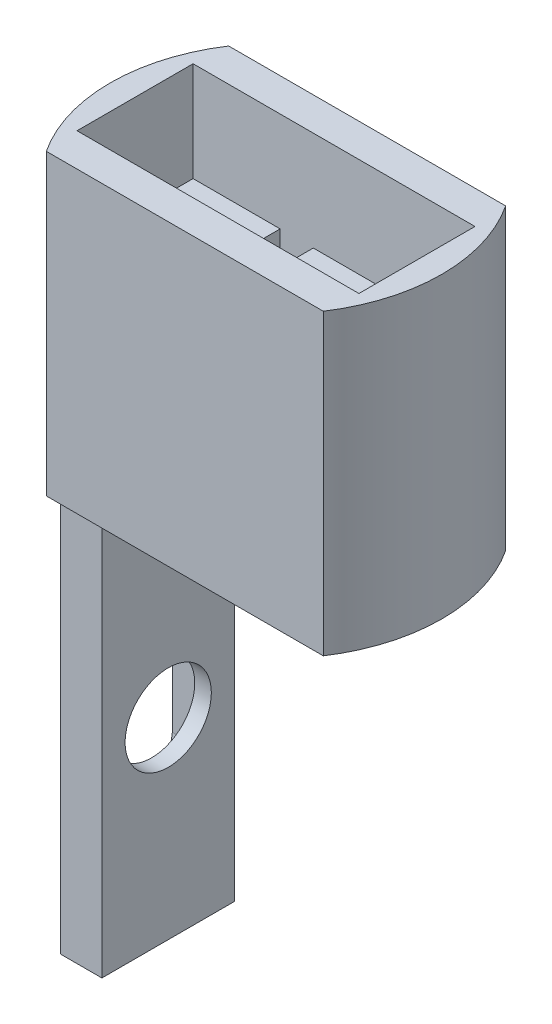
ISO-10303-21;
HEADER;
FILE_DESCRIPTION(('STEP AP214'),'2;1');
FILE_NAME('part.step','',(''),(''),'','','');
FILE_SCHEMA(('AUTOMOTIVE_DESIGN { 1 0 10303 214 1 1 1 1 }'));
ENDSEC;
DATA;
#1=APPLICATION_CONTEXT('core data for automotive mechanical design processes');
#2=APPLICATION_PROTOCOL_DEFINITION('international standard','automotive_design',2000,#1);
#3=PRODUCT_CONTEXT('',#1,'mechanical');
#4=PRODUCT('Part','Part','',(#3));
#5=PRODUCT_RELATED_PRODUCT_CATEGORY('part','',(#4));
#6=PRODUCT_DEFINITION_FORMATION('','',#4);
#7=PRODUCT_DEFINITION_CONTEXT('part definition',#1,'design');
#8=PRODUCT_DEFINITION('design','',#6,#7);
#9=PRODUCT_DEFINITION_SHAPE('','',#8);
#10=(LENGTH_UNIT() NAMED_UNIT(*) SI_UNIT(.MILLI.,.METRE.));
#11=(NAMED_UNIT(*) PLANE_ANGLE_UNIT() SI_UNIT($,.RADIAN.));
#12=(NAMED_UNIT(*) SI_UNIT($,.STERADIAN.) SOLID_ANGLE_UNIT());
#13=UNCERTAINTY_MEASURE_WITH_UNIT(LENGTH_MEASURE(1.E-05),#10,'distance_accuracy_value','');
#14=(GEOMETRIC_REPRESENTATION_CONTEXT(3) GLOBAL_UNCERTAINTY_ASSIGNED_CONTEXT((#13)) GLOBAL_UNIT_ASSIGNED_CONTEXT((#10,
#11,#12)) REPRESENTATION_CONTEXT('',''));
#15=CARTESIAN_POINT('',(0.,0.,0.));
#16=DIRECTION('',(0.,0.,1.));
#17=DIRECTION('',(1.,0.,0.));
#18=AXIS2_PLACEMENT_3D('',#15,#16,#17);
#19=CARTESIAN_POINT('',(-7.5,-2.9,2.75));
#20=DIRECTION('',(0.,1.,0.));
#21=DIRECTION('',(0.,0.,1.));
#22=AXIS2_PLACEMENT_3D('',#19,#20,#21);
#23=PLANE('',#22);
#24=DIRECTION('',(0.,0.,-1.));
#25=VECTOR('',#24,1.);
#26=CARTESIAN_POINT('',(-9.,-2.9,2.75));
#27=LINE('',#26,#25);
#28=CARTESIAN_POINT('',(-9.,-2.9,1.49997066480721));
#29=VERTEX_POINT('',#28);
#30=CARTESIAN_POINT('',(-9.,-2.9,-1.49997066480721));
#31=VERTEX_POINT('',#30);
#32=EDGE_CURVE('E61',#29,#31,#27,.T.);
#33=ORIENTED_EDGE('',*,*,#32,.T.);
#34=DIRECTION('',(-1.,0.,0.));
#35=VECTOR('',#34,1.);
#36=CARTESIAN_POINT('',(-7.5,-2.9,-1.49997066480721));
#37=LINE('',#36,#35);
#38=CARTESIAN_POINT('',(-7.5,-2.9,-1.49997066480721));
#39=VERTEX_POINT('',#38);
#40=EDGE_CURVE('E272',#39,#31,#37,.T.);
#41=ORIENTED_EDGE('',*,*,#40,.F.);
#42=DIRECTION('',(0.,0.,-1.));
#43=VECTOR('',#42,1.);
#44=CARTESIAN_POINT('',(-7.5,-2.9,2.75));
#45=LINE('',#44,#43);
#46=CARTESIAN_POINT('',(-7.5,-2.9,1.49997066480721));
#47=VERTEX_POINT('',#46);
#48=EDGE_CURVE('E366',#47,#39,#45,.T.);
#49=ORIENTED_EDGE('',*,*,#48,.F.);
#50=DIRECTION('',(-1.,0.,0.));
#51=VECTOR('',#50,1.);
#52=CARTESIAN_POINT('',(-7.5,-2.9,1.49997066480721));
#53=LINE('',#52,#51);
#54=EDGE_CURVE('E293',#47,#29,#53,.T.);
#55=ORIENTED_EDGE('',*,*,#54,.T.);
#56=EDGE_LOOP('',(#33,#41,#49,#55));
#57=FACE_BOUND('',#56,.T.);
#58=ADVANCED_FACE('F38',(#57),#23,.F.);
#59=CARTESIAN_POINT('',(-9.,-2.9,2.75));
#60=VERTEX_POINT('',#59);
#61=CARTESIAN_POINT('',(-9.,-2.9,2.7499706648072));
#62=VERTEX_POINT('',#61);
#63=EDGE_CURVE('E263',#60,#62,#27,.T.);
#64=ORIENTED_EDGE('',*,*,#63,.T.);
#65=DIRECTION('',(-1.,0.,0.));
#66=VECTOR('',#65,1.);
#67=CARTESIAN_POINT('',(-7.5,-2.9,2.7499706648072));
#68=LINE('',#67,#66);
#69=CARTESIAN_POINT('',(-7.5,-2.9,2.7499706648072));
#70=VERTEX_POINT('',#69);
#71=EDGE_CURVE('E298',#70,#62,#68,.T.);
#72=ORIENTED_EDGE('',*,*,#71,.F.);
#73=CARTESIAN_POINT('',(-7.5,-2.9,2.75));
#74=VERTEX_POINT('',#73);
#75=EDGE_CURVE('E362',#74,#70,#45,.T.);
#76=ORIENTED_EDGE('',*,*,#75,.F.);
#77=DIRECTION('',(-1.,0.,0.));
#78=VECTOR('',#77,1.);
#79=CARTESIAN_POINT('',(-7.5,-2.9,2.75));
#80=LINE('',#79,#78);
#81=EDGE_CURVE('E373',#74,#60,#80,.T.);
#82=ORIENTED_EDGE('',*,*,#81,.T.);
#83=EDGE_LOOP('',(#64,#72,#76,#82));
#84=FACE_BOUND('',#83,.T.);
#85=ADVANCED_FACE('F547',(#84),#23,.F.);
#86=CARTESIAN_POINT('',(-7.5,-23.9,2.75));
#87=DIRECTION('',(0.,-1.,0.));
#88=DIRECTION('',(0.,0.,-1.));
#89=AXIS2_PLACEMENT_3D('',#86,#87,#88);
#90=PLANE('',#89);
#91=DIRECTION('',(0.,0.,1.));
#92=VECTOR('',#91,1.);
#93=CARTESIAN_POINT('',(-9.,-23.9,2.75));
#94=LINE('',#93,#92);
#95=CARTESIAN_POINT('',(-9.,-23.9,-1.49997066480721));
#96=VERTEX_POINT('',#95);
#97=CARTESIAN_POINT('',(-9.,-23.9,1.49997066480721));
#98=VERTEX_POINT('',#97);
#99=EDGE_CURVE('E379',#96,#98,#94,.T.);
#100=ORIENTED_EDGE('',*,*,#99,.T.);
#101=DIRECTION('',(-1.,0.,0.));
#102=VECTOR('',#101,1.);
#103=CARTESIAN_POINT('',(-7.5,-23.9,1.49997066480721));
#104=LINE('',#103,#102);
#105=CARTESIAN_POINT('',(-7.5,-23.9,1.49997066480721));
#106=VERTEX_POINT('',#105);
#107=EDGE_CURVE('E312',#106,#98,#104,.T.);
#108=ORIENTED_EDGE('',*,*,#107,.F.);
#109=DIRECTION('',(0.,0.,1.));
#110=VECTOR('',#109,1.);
#111=CARTESIAN_POINT('',(-7.5,-23.9,2.75));
#112=LINE('',#111,#110);
#113=CARTESIAN_POINT('',(-7.5,-23.9,-1.49997066480721));
#114=VERTEX_POINT('',#113);
#115=EDGE_CURVE('E374',#114,#106,#112,.T.);
#116=ORIENTED_EDGE('',*,*,#115,.F.);
#117=DIRECTION('',(-1.,0.,0.));
#118=VECTOR('',#117,1.);
#119=CARTESIAN_POINT('',(-7.5,-23.9,-1.49997066480721));
#120=LINE('',#119,#118);
#121=EDGE_CURVE('E332',#114,#96,#120,.T.);
#122=ORIENTED_EDGE('',*,*,#121,.T.);
#123=EDGE_LOOP('',(#100,#108,#116,#122));
#124=FACE_BOUND('',#123,.T.);
#125=ADVANCED_FACE('F552',(#124),#90,.F.);
#126=CARTESIAN_POINT('',(-9.,-23.9,-2.75));
#127=VERTEX_POINT('',#126);
#128=CARTESIAN_POINT('',(-9.,-23.9,-2.7499706648072));
#129=VERTEX_POINT('',#128);
#130=EDGE_CURVE('E361',#127,#129,#94,.T.);
#131=ORIENTED_EDGE('',*,*,#130,.T.);
#132=DIRECTION('',(-1.,0.,0.));
#133=VECTOR('',#132,1.);
#134=CARTESIAN_POINT('',(-7.5,-23.9,-2.7499706648072));
#135=LINE('',#134,#133);
#136=CARTESIAN_POINT('',(-7.5,-23.9,-2.7499706648072));
#137=VERTEX_POINT('',#136);
#138=EDGE_CURVE('E337',#137,#129,#135,.T.);
#139=ORIENTED_EDGE('',*,*,#138,.F.);
#140=CARTESIAN_POINT('',(-7.5,-23.9,-2.75));
#141=VERTEX_POINT('',#140);
#142=EDGE_CURVE('E370',#141,#137,#112,.T.);
#143=ORIENTED_EDGE('',*,*,#142,.F.);
#144=DIRECTION('',(-1.,0.,0.));
#145=VECTOR('',#144,1.);
#146=CARTESIAN_POINT('',(-7.5,-23.9,-2.75));
#147=LINE('',#146,#145);
#148=EDGE_CURVE('E384',#141,#127,#147,.T.);
#149=ORIENTED_EDGE('',*,*,#148,.T.);
#150=EDGE_LOOP('',(#131,#139,#143,#149));
#151=FACE_BOUND('',#150,.T.);
#152=ADVANCED_FACE('F571',(#151),#90,.F.);
#153=CARTESIAN_POINT('',(0.,18.,0.));
#154=DIRECTION('',(0.,-1.,0.));
#155=DIRECTION('',(0.,0.,-1.));
#156=AXIS2_PLACEMENT_3D('',#153,#154,#155);
#157=CYLINDRICAL_SURFACE('',#156,10.);
#158=CARTESIAN_POINT('',(0.,18.,0.));
#159=DIRECTION('',(0.,1.,0.));
#160=DIRECTION('',(0.,0.,1.));
#161=AXIS2_PLACEMENT_3D('',#158,#159,#160);
#162=CIRCLE('',#161,10.);
#163=CARTESIAN_POINT('',(-8.35164654424503,18.,-5.5));
#164=VERTEX_POINT('',#163);
#165=CARTESIAN_POINT('',(-8.35164654424503,18.,5.5));
#166=VERTEX_POINT('',#165);
#167=EDGE_CURVE('E490',#164,#166,#162,.T.);
#168=ORIENTED_EDGE('',*,*,#167,.F.);
#169=DIRECTION('',(0.,-1.,0.));
#170=VECTOR('',#169,1.);
#171=CARTESIAN_POINT('',(-8.35164654424503,43.,-5.5));
#172=LINE('',#171,#170);
#173=CARTESIAN_POINT('',(-8.35164654424503,0.,-5.5));
#174=VERTEX_POINT('',#173);
#175=EDGE_CURVE('E349',#164,#174,#172,.T.);
#176=ORIENTED_EDGE('',*,*,#175,.T.);
#177=CARTESIAN_POINT('',(0.,0.,0.));
#178=DIRECTION('',(0.,1.,0.));
#179=DIRECTION('',(0.,0.,1.));
#180=AXIS2_PLACEMENT_3D('',#177,#178,#179);
#181=CIRCLE('',#180,10.);
#182=CARTESIAN_POINT('',(-8.35164654424503,0.,5.5));
#183=VERTEX_POINT('',#182);
#184=EDGE_CURVE('E486',#174,#183,#181,.T.);
#185=ORIENTED_EDGE('',*,*,#184,.T.);
#186=DIRECTION('',(0.,-1.,0.));
#187=VECTOR('',#186,1.);
#188=CARTESIAN_POINT('',(-8.35164654424503,43.,5.5));
#189=LINE('',#188,#187);
#190=EDGE_CURVE('E354',#166,#183,#189,.T.);
#191=ORIENTED_EDGE('',*,*,#190,.F.);
#192=EDGE_LOOP('',(#168,#176,#185,#191));
#193=FACE_BOUND('',#192,.T.);
#194=ADVANCED_FACE('F506',(#193),#157,.T.);
#195=CARTESIAN_POINT('',(-10.001,-13.4,0.));
#196=DIRECTION('',(1.,0.,0.));
#197=DIRECTION('',(0.,0.,-1.));
#198=AXIS2_PLACEMENT_3D('',#195,#196,#197);
#199=CYLINDRICAL_SURFACE('',#198,2.6);
#200=CARTESIAN_POINT('',(-6.5,-13.4,0.));
#201=DIRECTION('',(1.,0.,0.));
#202=DIRECTION('',(0.,0.,-1.));
#203=AXIS2_PLACEMENT_3D('',#200,#201,#202);
#204=CIRCLE('',#203,2.6);
#205=CARTESIAN_POINT('',(-6.5,-13.4,-2.6));
#206=VERTEX_POINT('',#205);
#207=EDGE_CURVE('E444',#206,#206,#204,.T.);
#208=CARTESIAN_POINT('',(-7.5,-13.4,0.));
#209=DIRECTION('',(-1.,0.,0.));
#210=DIRECTION('',(0.,0.,1.));
#211=AXIS2_PLACEMENT_3D('',#208,#209,#210);
#212=CIRCLE('',#211,2.6);
#213=CARTESIAN_POINT('',(-7.5,-13.4,-2.6));
#214=VERTEX_POINT('',#213);
#215=EDGE_CURVE('E383',#214,#214,#212,.F.);
#216=CARTESIAN_POINT('',(-6.5,-13.4,-2.6));
#217=CARTESIAN_POINT('',(-6.51041666666667,-13.4,-2.6));
#218=CARTESIAN_POINT('',(-6.52083333333333,-13.4,-2.6));
#219=CARTESIAN_POINT('',(-6.54166666666667,-13.4,-2.6));
#220=CARTESIAN_POINT('',(-6.55208333333333,-13.4,-2.6));
#221=CARTESIAN_POINT('',(-6.57291666666667,-13.4,-2.6));
#222=CARTESIAN_POINT('',(-6.58333333333333,-13.4,-2.6));
#223=CARTESIAN_POINT('',(-6.60416666666667,-13.4,-2.6));
#224=CARTESIAN_POINT('',(-6.61458333333333,-13.4,-2.6));
#225=CARTESIAN_POINT('',(-6.63541666666667,-13.4,-2.6));
#226=CARTESIAN_POINT('',(-6.64583333333333,-13.4,-2.6));
#227=CARTESIAN_POINT('',(-6.66666666666667,-13.4,-2.6));
#228=CARTESIAN_POINT('',(-6.67708333333333,-13.4,-2.6));
#229=CARTESIAN_POINT('',(-6.69791666666667,-13.4,-2.6));
#230=CARTESIAN_POINT('',(-6.70833333333333,-13.4,-2.6));
#231=CARTESIAN_POINT('',(-6.72916666666667,-13.4,-2.6));
#232=CARTESIAN_POINT('',(-6.73958333333333,-13.4,-2.6));
#233=CARTESIAN_POINT('',(-6.76041666666667,-13.4,-2.6));
#234=CARTESIAN_POINT('',(-6.77083333333333,-13.4,-2.6));
#235=CARTESIAN_POINT('',(-6.79166666666667,-13.4,-2.6));
#236=CARTESIAN_POINT('',(-6.80208333333333,-13.4,-2.6));
#237=CARTESIAN_POINT('',(-6.82291666666667,-13.4,-2.6));
#238=CARTESIAN_POINT('',(-6.83333333333333,-13.4,-2.6));
#239=CARTESIAN_POINT('',(-6.85416666666667,-13.4,-2.6));
#240=CARTESIAN_POINT('',(-6.86458333333333,-13.4,-2.6));
#241=CARTESIAN_POINT('',(-6.88541666666667,-13.4,-2.6));
#242=CARTESIAN_POINT('',(-6.89583333333333,-13.4,-2.6));
#243=CARTESIAN_POINT('',(-6.91666666666667,-13.4,-2.6));
#244=CARTESIAN_POINT('',(-6.92708333333333,-13.4,-2.6));
#245=CARTESIAN_POINT('',(-6.94791666666667,-13.4,-2.6));
#246=CARTESIAN_POINT('',(-6.95833333333333,-13.4,-2.6));
#247=CARTESIAN_POINT('',(-6.97916666666667,-13.4,-2.6));
#248=CARTESIAN_POINT('',(-6.98958333333333,-13.4,-2.6));
#249=CARTESIAN_POINT('',(-7.01041666666667,-13.4,-2.6));
#250=CARTESIAN_POINT('',(-7.02083333333333,-13.4,-2.6));
#251=CARTESIAN_POINT('',(-7.04166666666667,-13.4,-2.6));
#252=CARTESIAN_POINT('',(-7.05208333333333,-13.4,-2.6));
#253=CARTESIAN_POINT('',(-7.07291666666667,-13.4,-2.6));
#254=CARTESIAN_POINT('',(-7.08333333333333,-13.4,-2.6));
#255=CARTESIAN_POINT('',(-7.10416666666667,-13.4,-2.6));
#256=CARTESIAN_POINT('',(-7.11458333333333,-13.4,-2.6));
#257=CARTESIAN_POINT('',(-7.13541666666667,-13.4,-2.6));
#258=CARTESIAN_POINT('',(-7.14583333333333,-13.4,-2.6));
#259=CARTESIAN_POINT('',(-7.16666666666667,-13.4,-2.6));
#260=CARTESIAN_POINT('',(-7.17708333333333,-13.4,-2.6));
#261=CARTESIAN_POINT('',(-7.19791666666667,-13.4,-2.6));
#262=CARTESIAN_POINT('',(-7.20833333333333,-13.4,-2.6));
#263=CARTESIAN_POINT('',(-7.22916666666667,-13.4,-2.6));
#264=CARTESIAN_POINT('',(-7.23958333333333,-13.4,-2.6));
#265=CARTESIAN_POINT('',(-7.26041666666667,-13.4,-2.6));
#266=CARTESIAN_POINT('',(-7.27083333333333,-13.4,-2.6));
#267=CARTESIAN_POINT('',(-7.29166666666667,-13.4,-2.6));
#268=CARTESIAN_POINT('',(-7.30208333333333,-13.4,-2.6));
#269=CARTESIAN_POINT('',(-7.32291666666667,-13.4,-2.6));
#270=CARTESIAN_POINT('',(-7.33333333333333,-13.4,-2.6));
#271=CARTESIAN_POINT('',(-7.35416666666667,-13.4,-2.6));
#272=CARTESIAN_POINT('',(-7.36458333333333,-13.4,-2.6));
#273=CARTESIAN_POINT('',(-7.38541666666667,-13.4,-2.6));
#274=CARTESIAN_POINT('',(-7.39583333333333,-13.4,-2.6));
#275=CARTESIAN_POINT('',(-7.41666666666667,-13.4,-2.6));
#276=CARTESIAN_POINT('',(-7.42708333333333,-13.4,-2.6));
#277=CARTESIAN_POINT('',(-7.44791666666667,-13.4,-2.6));
#278=CARTESIAN_POINT('',(-7.45833333333333,-13.4,-2.6));
#279=CARTESIAN_POINT('',(-7.47916666666667,-13.4,-2.6));
#280=CARTESIAN_POINT('',(-7.48958333333333,-13.4,-2.6));
#281=CARTESIAN_POINT('',(-7.5,-13.4,-2.6));
#282=B_SPLINE_CURVE_WITH_KNOTS('',3,(#216,#217,#218,#219,#220,#221,#222,#223,#224,#225,#226,
#227,#228,#229,#230,#231,#232,#233,#234,#235,#236,#237,#238,#239,#240,#241,#242,#243,#244,#245,
#246,#247,#248,#249,#250,#251,#252,#253,#254,#255,#256,#257,#258,#259,#260,#261,#262,#263,#264,
#265,#266,#267,#268,#269,#270,#271,#272,#273,#274,#275,#276,#277,#278,#279,#280,#281),
.UNSPECIFIED.,.F.,.F.,(4,2,2,2,2,2,2,2,2,2,2,2,2,2,2,2,2,2,2,2,2,2,2,2,2,2,2,2,2,2,2,2,4),(0.,
0.03125,0.0625000000000001,0.0937500000000001,0.125,0.15625,0.1875,0.21875,0.25,0.28125,
0.312500000000001,0.343750000000001,0.375000000000001,0.406250000000001,0.437500000000001,
0.468750000000001,0.500000000000001,0.531250000000001,0.562500000000001,0.593750000000001,
0.625000000000001,0.656250000000001,0.687500000000002,0.718750000000002,0.750000000000002,
0.781250000000002,0.812500000000002,0.843750000000002,0.875000000000003,0.906250000000003,
0.937500000000003,0.968750000000003,1.),.UNSPECIFIED.);
#283=EDGE_CURVE('BSEAM677',#206,#214,#282,.T.);
#284=ORIENTED_EDGE('',*,*,#207,.T.);
#285=ORIENTED_EDGE('',*,*,#215,.F.);
#286=ORIENTED_EDGE('',*,*,#283,.T.);
#287=ORIENTED_EDGE('',*,*,#283,.F.);
#288=EDGE_LOOP('',(#284,#286,#285,#287));
#289=FACE_BOUND('',#288,.T.);
#290=ADVANCED_FACE('F677',(#289),#199,.F.);
#291=CARTESIAN_POINT('',(0.,12.,0.));
#292=DIRECTION('',(0.,-1.,0.));
#293=DIRECTION('',(0.,0.,-1.));
#294=AXIS2_PLACEMENT_3D('',#291,#292,#293);
#295=PLANE('',#294);
#296=DIRECTION('',(0.,0.,-1.));
#297=VECTOR('',#296,1.);
#298=CARTESIAN_POINT('',(-1.25,12.,-3.5));
#299=LINE('',#298,#297);
#300=CARTESIAN_POINT('',(-1.25,12.,3.5));
#301=VERTEX_POINT('',#300);
#302=CARTESIAN_POINT('',(-1.25,12.,-3.5));
#303=VERTEX_POINT('',#302);
#304=EDGE_CURVE('E404',#301,#303,#299,.T.);
#305=ORIENTED_EDGE('',*,*,#304,.F.);
#306=DIRECTION('',(1.,0.,0.));
#307=VECTOR('',#306,1.);
#308=CARTESIAN_POINT('',(-8.5,12.,3.5));
#309=LINE('',#308,#307);
#310=CARTESIAN_POINT('',(8.5,12.,3.5));
#311=VERTEX_POINT('',#310);
#312=EDGE_CURVE('E420',#301,#311,#309,.T.);
#313=ORIENTED_EDGE('',*,*,#312,.T.);
#314=DIRECTION('',(0.,0.,-1.));
#315=VECTOR('',#314,1.);
#316=CARTESIAN_POINT('',(8.5,12.,3.5));
#317=LINE('',#316,#315);
#318=CARTESIAN_POINT('',(8.5,12.,-3.5));
#319=VERTEX_POINT('',#318);
#320=EDGE_CURVE('E425',#311,#319,#317,.T.);
#321=ORIENTED_EDGE('',*,*,#320,.T.);
#322=DIRECTION('',(-1.,0.,0.));
#323=VECTOR('',#322,1.);
#324=CARTESIAN_POINT('',(-8.5,12.,-3.5));
#325=LINE('',#324,#323);
#326=EDGE_CURVE('E429',#319,#303,#325,.T.);
#327=ORIENTED_EDGE('',*,*,#326,.T.);
#328=EDGE_LOOP('',(#305,#313,#321,#327));
#329=FACE_BOUND('',#328,.T.);
#330=ADVANCED_FACE('F702',(#329),#295,.F.);
#331=DIRECTION('',(0.,0.,1.));
#332=VECTOR('',#331,1.);
#333=CARTESIAN_POINT('',(-3.25,12.,-3.5));
#334=LINE('',#333,#332);
#335=CARTESIAN_POINT('',(-3.25,12.,-3.5));
#336=VERTEX_POINT('',#335);
#337=CARTESIAN_POINT('',(-3.25,12.,3.5));
#338=VERTEX_POINT('',#337);
#339=EDGE_CURVE('E394',#336,#338,#334,.T.);
#340=ORIENTED_EDGE('',*,*,#339,.F.);
#341=CARTESIAN_POINT('',(-8.5,12.,-3.5));
#342=VERTEX_POINT('',#341);
#343=EDGE_CURVE('E428',#336,#342,#325,.T.);
#344=ORIENTED_EDGE('',*,*,#343,.T.);
#345=DIRECTION('',(0.,0.,1.));
#346=VECTOR('',#345,1.);
#347=CARTESIAN_POINT('',(-8.5,12.,3.5));
#348=LINE('',#347,#346);
#349=CARTESIAN_POINT('',(-8.5,12.,3.5));
#350=VERTEX_POINT('',#349);
#351=EDGE_CURVE('E417',#342,#350,#348,.T.);
#352=ORIENTED_EDGE('',*,*,#351,.T.);
#353=EDGE_CURVE('E422',#350,#338,#309,.T.);
#354=ORIENTED_EDGE('',*,*,#353,.T.);
#355=EDGE_LOOP('',(#340,#344,#352,#354));
#356=FACE_BOUND('',#355,.T.);
#357=ADVANCED_FACE('F521',(#356),#295,.F.);
#358=CARTESIAN_POINT('',(0.,0.,0.));
#359=DIRECTION('',(0.,1.,0.));
#360=DIRECTION('',(0.,0.,1.));
#361=AXIS2_PLACEMENT_3D('',#358,#359,#360);
#362=PLANE('',#361);
#363=ORIENTED_EDGE('',*,*,#184,.F.);
#364=DIRECTION('',(-1.,0.,0.));
#365=VECTOR('',#364,1.);
#366=CARTESIAN_POINT('',(8.35164654424503,0.,-5.5));
#367=LINE('',#366,#365);
#368=CARTESIAN_POINT('',(8.35164654424503,0.,-5.5));
#369=VERTEX_POINT('',#368);
#370=EDGE_CURVE('E345',#369,#174,#367,.T.);
#371=ORIENTED_EDGE('',*,*,#370,.F.);
#372=CARTESIAN_POINT('',(8.35164654424503,0.,5.5));
#373=VERTEX_POINT('',#372);
#374=EDGE_CURVE('E491',#373,#369,#181,.T.);
#375=ORIENTED_EDGE('',*,*,#374,.F.);
#376=DIRECTION('',(1.,0.,0.));
#377=VECTOR('',#376,1.);
#378=CARTESIAN_POINT('',(8.35164654424503,0.,5.5));
#379=LINE('',#378,#377);
#380=EDGE_CURVE('E340',#183,#373,#379,.T.);
#381=ORIENTED_EDGE('',*,*,#380,.F.);
#382=EDGE_LOOP('',(#363,#371,#375,#381));
#383=FACE_BOUND('',#382,.T.);
#384=DIRECTION('',(0.,0.,1.));
#385=VECTOR('',#384,1.);
#386=CARTESIAN_POINT('',(-6.5,0.,-4.));
#387=LINE('',#386,#385);
#388=CARTESIAN_POINT('',(-6.5,0.,-4.));
#389=VERTEX_POINT('',#388);
#390=CARTESIAN_POINT('',(-6.5,0.,4.));
#391=VERTEX_POINT('',#390);
#392=EDGE_CURVE('E453',#389,#391,#387,.T.);
#393=ORIENTED_EDGE('',*,*,#392,.F.);
#394=DIRECTION('',(1.,0.,0.));
#395=VECTOR('',#394,1.);
#396=CARTESIAN_POINT('',(-9.,0.,-4.));
#397=LINE('',#396,#395);
#398=CARTESIAN_POINT('',(-9.,0.,-4.));
#399=VERTEX_POINT('',#398);
#400=EDGE_CURVE('E458',#399,#389,#397,.T.);
#401=ORIENTED_EDGE('',*,*,#400,.F.);
#402=DIRECTION('',(0.,0.,-1.));
#403=VECTOR('',#402,1.);
#404=CARTESIAN_POINT('',(-9.,0.,-4.));
#405=LINE('',#404,#403);
#406=CARTESIAN_POINT('',(-9.,0.,4.));
#407=VERTEX_POINT('',#406);
#408=EDGE_CURVE('E470',#407,#399,#405,.T.);
#409=ORIENTED_EDGE('',*,*,#408,.F.);
#410=DIRECTION('',(-1.,0.,0.));
#411=VECTOR('',#410,1.);
#412=CARTESIAN_POINT('',(-9.,0.,4.));
#413=LINE('',#412,#411);
#414=EDGE_CURVE('E467',#391,#407,#413,.T.);
#415=ORIENTED_EDGE('',*,*,#414,.F.);
#416=EDGE_LOOP('',(#393,#401,#409,#415));
#417=FACE_BOUND('',#416,.T.);
#418=ADVANCED_FACE('F518',(#383,#417),#362,.F.);
#419=ORIENTED_EDGE('',*,*,#374,.T.);
#420=DIRECTION('',(0.,-1.,0.));
#421=VECTOR('',#420,1.);
#422=CARTESIAN_POINT('',(8.35164654424503,43.,-5.5));
#423=LINE('',#422,#421);
#424=CARTESIAN_POINT('',(8.35164654424503,18.,-5.5));
#425=VERTEX_POINT('',#424);
#426=EDGE_CURVE('E347',#425,#369,#423,.T.);
#427=ORIENTED_EDGE('',*,*,#426,.F.);
#428=CARTESIAN_POINT('',(8.35164654424503,18.,5.5));
#429=VERTEX_POINT('',#428);
#430=EDGE_CURVE('E487',#429,#425,#162,.T.);
#431=ORIENTED_EDGE('',*,*,#430,.F.);
#432=DIRECTION('',(0.,-1.,0.));
#433=VECTOR('',#432,1.);
#434=CARTESIAN_POINT('',(8.35164654424503,43.,5.5));
#435=LINE('',#434,#433);
#436=EDGE_CURVE('E348',#429,#373,#435,.T.);
#437=ORIENTED_EDGE('',*,*,#436,.T.);
#438=EDGE_LOOP('',(#419,#427,#431,#437));
#439=FACE_BOUND('',#438,.T.);
#440=ADVANCED_FACE('F40',(#439),#157,.T.);
#441=CARTESIAN_POINT('',(0.,18.,0.));
#442=DIRECTION('',(0.,1.,0.));
#443=DIRECTION('',(0.,0.,1.));
#444=AXIS2_PLACEMENT_3D('',#441,#442,#443);
#445=PLANE('',#444);
#446=DIRECTION('',(1.,0.,0.));
#447=VECTOR('',#446,1.);
#448=CARTESIAN_POINT('',(0.,18.,-5.5));
#449=LINE('',#448,#447);
#450=EDGE_CURVE('E12',#164,#425,#449,.T.);
#451=ORIENTED_EDGE('',*,*,#450,.F.);
#452=ORIENTED_EDGE('',*,*,#167,.T.);
#453=DIRECTION('',(-1.,0.,0.));
#454=VECTOR('',#453,1.);
#455=CARTESIAN_POINT('',(0.,18.,5.5));
#456=LINE('',#455,#454);
#457=EDGE_CURVE('E46',#429,#166,#456,.T.);
#458=ORIENTED_EDGE('',*,*,#457,.F.);
#459=ORIENTED_EDGE('',*,*,#430,.T.);
#460=EDGE_LOOP('',(#451,#452,#458,#459));
#461=FACE_BOUND('',#460,.T.);
#462=DIRECTION('',(0.,0.,1.));
#463=VECTOR('',#462,1.);
#464=CARTESIAN_POINT('',(-8.5,18.,3.5));
#465=LINE('',#464,#463);
#466=CARTESIAN_POINT('',(-8.5,18.,-3.5));
#467=VERTEX_POINT('',#466);
#468=CARTESIAN_POINT('',(-8.5,18.,3.5));
#469=VERTEX_POINT('',#468);
#470=EDGE_CURVE('E411',#467,#469,#465,.T.);
#471=ORIENTED_EDGE('',*,*,#470,.F.);
#472=DIRECTION('',(-1.,0.,0.));
#473=VECTOR('',#472,1.);
#474=CARTESIAN_POINT('',(-8.5,18.,-3.5));
#475=LINE('',#474,#473);
#476=CARTESIAN_POINT('',(8.5,18.,-3.5));
#477=VERTEX_POINT('',#476);
#478=EDGE_CURVE('E421',#477,#467,#475,.T.);
#479=ORIENTED_EDGE('',*,*,#478,.F.);
#480=DIRECTION('',(0.,0.,-1.));
#481=VECTOR('',#480,1.);
#482=CARTESIAN_POINT('',(8.5,18.,3.5));
#483=LINE('',#482,#481);
#484=CARTESIAN_POINT('',(8.5,18.,3.5));
#485=VERTEX_POINT('',#484);
#486=EDGE_CURVE('E437',#485,#477,#483,.T.);
#487=ORIENTED_EDGE('',*,*,#486,.F.);
#488=DIRECTION('',(1.,0.,0.));
#489=VECTOR('',#488,1.);
#490=CARTESIAN_POINT('',(-8.5,18.,3.5));
#491=LINE('',#490,#489);
#492=EDGE_CURVE('E434',#469,#485,#491,.T.);
#493=ORIENTED_EDGE('',*,*,#492,.F.);
#494=EDGE_LOOP('',(#471,#479,#487,#493));
#495=FACE_BOUND('',#494,.T.);
#496=ADVANCED_FACE('F509',(#461,#495),#445,.T.);
#497=CARTESIAN_POINT('',(-6.5,-25.,-4.));
#498=DIRECTION('',(-1.,0.,0.));
#499=DIRECTION('',(0.,0.,1.));
#500=AXIS2_PLACEMENT_3D('',#497,#498,#499);
#501=PLANE('',#500);
#502=ORIENTED_EDGE('',*,*,#207,.F.);
#503=EDGE_LOOP('',(#502));
#504=FACE_BOUND('',#503,.T.);
#505=ORIENTED_EDGE('',*,*,#392,.T.);
#506=DIRECTION('',(0.,1.,0.));
#507=VECTOR('',#506,1.);
#508=CARTESIAN_POINT('',(-6.5,-25.,4.));
#509=LINE('',#508,#507);
#510=CARTESIAN_POINT('',(-6.5,-25.,4.));
#511=VERTEX_POINT('',#510);
#512=EDGE_CURVE('E483',#511,#391,#509,.T.);
#513=ORIENTED_EDGE('',*,*,#512,.F.);
#514=DIRECTION('',(0.,0.,1.));
#515=VECTOR('',#514,1.);
#516=CARTESIAN_POINT('',(-6.5,-25.,-4.));
#517=LINE('',#516,#515);
#518=CARTESIAN_POINT('',(-6.5,-25.,-4.));
#519=VERTEX_POINT('',#518);
#520=EDGE_CURVE('E454',#519,#511,#517,.T.);
#521=ORIENTED_EDGE('',*,*,#520,.F.);
#522=DIRECTION('',(0.,1.,0.));
#523=VECTOR('',#522,1.);
#524=CARTESIAN_POINT('',(-6.5,-25.,-4.));
#525=LINE('',#524,#523);
#526=EDGE_CURVE('E464',#519,#389,#525,.T.);
#527=ORIENTED_EDGE('',*,*,#526,.T.);
#528=EDGE_LOOP('',(#505,#513,#521,#527));
#529=FACE_BOUND('',#528,.T.);
#530=ADVANCED_FACE('F530',(#504,#529),#501,.F.);
#531=CARTESIAN_POINT('',(-9.,-25.,4.));
#532=DIRECTION('',(0.,0.,-1.));
#533=DIRECTION('',(-1.,0.,0.));
#534=AXIS2_PLACEMENT_3D('',#531,#532,#533);
#535=PLANE('',#534);
#536=ORIENTED_EDGE('',*,*,#414,.T.);
#537=DIRECTION('',(0.,1.,0.));
#538=VECTOR('',#537,1.);
#539=CARTESIAN_POINT('',(-9.,-25.,4.));
#540=LINE('',#539,#538);
#541=CARTESIAN_POINT('',(-9.,-25.,4.));
#542=VERTEX_POINT('',#541);
#543=EDGE_CURVE('E480',#542,#407,#540,.T.);
#544=ORIENTED_EDGE('',*,*,#543,.F.);
#545=DIRECTION('',(-1.,0.,0.));
#546=VECTOR('',#545,1.);
#547=CARTESIAN_POINT('',(-9.,-25.,4.));
#548=LINE('',#547,#546);
#549=EDGE_CURVE('E457',#511,#542,#548,.T.);
#550=ORIENTED_EDGE('',*,*,#549,.F.);
#551=ORIENTED_EDGE('',*,*,#512,.T.);
#552=EDGE_LOOP('',(#536,#544,#550,#551));
#553=FACE_BOUND('',#552,.T.);
#554=ADVANCED_FACE('F536',(#553),#535,.F.);
#555=CARTESIAN_POINT('',(-9.,-25.,-4.));
#556=DIRECTION('',(1.,0.,0.));
#557=DIRECTION('',(0.,0.,-1.));
#558=AXIS2_PLACEMENT_3D('',#555,#556,#557);
#559=PLANE('',#558);
#560=ORIENTED_EDGE('',*,*,#63,.F.);
#561=DIRECTION('',(0.,1.,0.));
#562=VECTOR('',#561,1.);
#563=CARTESIAN_POINT('',(-9.,-23.9,2.75));
#564=LINE('',#563,#562);
#565=CARTESIAN_POINT('',(-9.,-23.9,2.75));
#566=VERTEX_POINT('',#565);
#567=EDGE_CURVE('E261',#566,#60,#564,.T.);
#568=ORIENTED_EDGE('',*,*,#567,.F.);
#569=CARTESIAN_POINT('',(-9.,-23.9,2.7499706648072));
#570=VERTEX_POINT('',#569);
#571=EDGE_CURVE('E377',#570,#566,#94,.T.);
#572=ORIENTED_EDGE('',*,*,#571,.F.);
#573=DIRECTION('',(0.,1.,0.));
#574=VECTOR('',#573,1.);
#575=CARTESIAN_POINT('',(-9.,-23.9,2.7499706648072));
#576=LINE('',#575,#574);
#577=CARTESIAN_POINT('',(-9.,-16.8,2.74997066480719));
#578=VERTEX_POINT('',#577);
#579=EDGE_CURVE('E309',#570,#578,#576,.T.);
#580=ORIENTED_EDGE('',*,*,#579,.T.);
#581=DIRECTION('',(0.,-0.984853300679229,-0.173389665612539));
#582=VECTOR('',#581,1.);
#583=CARTESIAN_POINT('',(-9.,-16.8,2.74997066480719));
#584=LINE('',#583,#582);
#585=EDGE_CURVE('E301',#578,#98,#584,.T.);
#586=ORIENTED_EDGE('',*,*,#585,.T.);
#587=ORIENTED_EDGE('',*,*,#99,.F.);
#588=DIRECTION('',(0.,0.984853300679229,-0.173389665612539));
#589=VECTOR('',#588,1.);
#590=CARTESIAN_POINT('',(-9.,-16.8,-2.7499706648072));
#591=LINE('',#590,#589);
#592=CARTESIAN_POINT('',(-9.,-16.8,-2.7499706648072));
#593=VERTEX_POINT('',#592);
#594=EDGE_CURVE('E319',#96,#593,#591,.T.);
#595=ORIENTED_EDGE('',*,*,#594,.T.);
#596=DIRECTION('',(0.,-1.,0.));
#597=VECTOR('',#596,1.);
#598=CARTESIAN_POINT('',(-9.,-23.9,-2.7499706648072));
#599=LINE('',#598,#597);
#600=EDGE_CURVE('E329',#593,#129,#599,.T.);
#601=ORIENTED_EDGE('',*,*,#600,.T.);
#602=ORIENTED_EDGE('',*,*,#130,.F.);
#603=DIRECTION('',(0.,-1.,0.));
#604=VECTOR('',#603,1.);
#605=CARTESIAN_POINT('',(-9.,-23.9,-2.75));
#606=LINE('',#605,#604);
#607=CARTESIAN_POINT('',(-9.,-2.9,-2.75));
#608=VERTEX_POINT('',#607);
#609=EDGE_CURVE('E257',#608,#127,#606,.T.);
#610=ORIENTED_EDGE('',*,*,#609,.F.);
#611=CARTESIAN_POINT('',(-9.,-2.9,-2.7499706648072));
#612=VERTEX_POINT('',#611);
#613=EDGE_CURVE('E247',#612,#608,#27,.T.);
#614=ORIENTED_EDGE('',*,*,#613,.F.);
#615=DIRECTION('',(0.,-1.,0.));
#616=VECTOR('',#615,1.);
#617=CARTESIAN_POINT('',(-9.,-2.9,-2.7499706648072));
#618=LINE('',#617,#616);
#619=CARTESIAN_POINT('',(-9.,-9.99999999999999,-2.7499706648072));
#620=VERTEX_POINT('',#619);
#621=EDGE_CURVE('E254',#612,#620,#618,.T.);
#622=ORIENTED_EDGE('',*,*,#621,.T.);
#623=DIRECTION('',(0.,0.984853300679229,0.173389665612539));
#624=VECTOR('',#623,1.);
#625=CARTESIAN_POINT('',(-9.,-9.99999999999999,-2.7499706648072));
#626=LINE('',#625,#624);
#627=EDGE_CURVE('E276',#620,#31,#626,.T.);
#628=ORIENTED_EDGE('',*,*,#627,.T.);
#629=ORIENTED_EDGE('',*,*,#32,.F.);
#630=DIRECTION('',(0.,-0.984853300679229,0.173389665612538));
#631=VECTOR('',#630,1.);
#632=CARTESIAN_POINT('',(-9.,-9.99999999999999,2.74997066480719));
#633=LINE('',#632,#631);
#634=CARTESIAN_POINT('',(-9.,-9.99999999999999,2.74997066480719));
#635=VERTEX_POINT('',#634);
#636=EDGE_CURVE('E283',#29,#635,#633,.T.);
#637=ORIENTED_EDGE('',*,*,#636,.T.);
#638=DIRECTION('',(0.,1.,0.));
#639=VECTOR('',#638,1.);
#640=CARTESIAN_POINT('',(-9.,-2.9,2.7499706648072));
#641=LINE('',#640,#639);
#642=EDGE_CURVE('E290',#635,#62,#641,.T.);
#643=ORIENTED_EDGE('',*,*,#642,.T.);
#644=EDGE_LOOP('',(#560,#568,#572,#580,#586,#587,#595,#601,#602,#610,#614,#622,#628,#629,#637,#643));
#645=FACE_BOUND('',#644,.T.);
#646=ORIENTED_EDGE('',*,*,#408,.T.);
#647=DIRECTION('',(0.,1.,0.));
#648=VECTOR('',#647,1.);
#649=CARTESIAN_POINT('',(-9.,-25.,-4.));
#650=LINE('',#649,#648);
#651=CARTESIAN_POINT('',(-9.,-25.,-4.));
#652=VERTEX_POINT('',#651);
#653=EDGE_CURVE('E477',#652,#399,#650,.T.);
#654=ORIENTED_EDGE('',*,*,#653,.F.);
#655=DIRECTION('',(0.,0.,-1.));
#656=VECTOR('',#655,1.);
#657=CARTESIAN_POINT('',(-9.,-25.,-4.));
#658=LINE('',#657,#656);
#659=EDGE_CURVE('E460',#542,#652,#658,.T.);
#660=ORIENTED_EDGE('',*,*,#659,.F.);
#661=ORIENTED_EDGE('',*,*,#543,.T.);
#662=EDGE_LOOP('',(#646,#654,#660,#661));
#663=FACE_BOUND('',#662,.T.);
#664=ADVANCED_FACE('F250',(#645,#663),#559,.F.);
#665=CARTESIAN_POINT('',(-9.,-25.,-4.));
#666=DIRECTION('',(0.,0.,1.));
#667=DIRECTION('',(1.,0.,0.));
#668=AXIS2_PLACEMENT_3D('',#665,#666,#667);
#669=PLANE('',#668);
#670=ORIENTED_EDGE('',*,*,#400,.T.);
#671=ORIENTED_EDGE('',*,*,#526,.F.);
#672=DIRECTION('',(1.,0.,0.));
#673=VECTOR('',#672,1.);
#674=CARTESIAN_POINT('',(-9.,-25.,-4.));
#675=LINE('',#674,#673);
#676=EDGE_CURVE('E462',#652,#519,#675,.T.);
#677=ORIENTED_EDGE('',*,*,#676,.F.);
#678=ORIENTED_EDGE('',*,*,#653,.T.);
#679=EDGE_LOOP('',(#670,#671,#677,#678));
#680=FACE_BOUND('',#679,.T.);
#681=ADVANCED_FACE('F526',(#680),#669,.F.);
#682=CARTESIAN_POINT('',(0.,-25.,0.));
#683=DIRECTION('',(0.,1.,0.));
#684=DIRECTION('',(0.,0.,1.));
#685=AXIS2_PLACEMENT_3D('',#682,#683,#684);
#686=PLANE('',#685);
#687=ORIENTED_EDGE('',*,*,#520,.T.);
#688=ORIENTED_EDGE('',*,*,#549,.T.);
#689=ORIENTED_EDGE('',*,*,#659,.T.);
#690=ORIENTED_EDGE('',*,*,#676,.T.);
#691=EDGE_LOOP('',(#687,#688,#689,#690));
#692=FACE_BOUND('',#691,.T.);
#693=ADVANCED_FACE('F532',(#692),#686,.F.);
#694=CARTESIAN_POINT('',(-8.5,12.,3.5));
#695=DIRECTION('',(-1.,0.,0.));
#696=DIRECTION('',(0.,0.,1.));
#697=AXIS2_PLACEMENT_3D('',#694,#695,#696);
#698=PLANE('',#697);
#699=ORIENTED_EDGE('',*,*,#470,.T.);
#700=DIRECTION('',(0.,1.,0.));
#701=VECTOR('',#700,1.);
#702=CARTESIAN_POINT('',(-8.5,12.,3.5));
#703=LINE('',#702,#701);
#704=EDGE_CURVE('E432',#350,#469,#703,.T.);
#705=ORIENTED_EDGE('',*,*,#704,.F.);
#706=ORIENTED_EDGE('',*,*,#351,.F.);
#707=DIRECTION('',(0.,1.,0.));
#708=VECTOR('',#707,1.);
#709=CARTESIAN_POINT('',(-8.5,12.,-3.5));
#710=LINE('',#709,#708);
#711=EDGE_CURVE('E442',#342,#467,#710,.T.);
#712=ORIENTED_EDGE('',*,*,#711,.T.);
#713=EDGE_LOOP('',(#699,#705,#706,#712));
#714=FACE_BOUND('',#713,.T.);
#715=ADVANCED_FACE('F756',(#714),#698,.F.);
#716=CARTESIAN_POINT('',(-8.5,12.,-3.5));
#717=DIRECTION('',(0.,0.,-1.));
#718=DIRECTION('',(-1.,0.,0.));
#719=AXIS2_PLACEMENT_3D('',#716,#717,#718);
#720=PLANE('',#719);
#721=ORIENTED_EDGE('',*,*,#478,.T.);
#722=ORIENTED_EDGE('',*,*,#711,.F.);
#723=ORIENTED_EDGE('',*,*,#343,.F.);
#724=DIRECTION('',(0.,1.,0.));
#725=VECTOR('',#724,1.);
#726=CARTESIAN_POINT('',(-3.25,8.,-3.5));
#727=LINE('',#726,#725);
#728=CARTESIAN_POINT('',(-3.25,8.,-3.5));
#729=VERTEX_POINT('',#728);
#730=EDGE_CURVE('E414',#729,#336,#727,.T.);
#731=ORIENTED_EDGE('',*,*,#730,.F.);
#732=DIRECTION('',(-1.,0.,0.));
#733=VECTOR('',#732,1.);
#734=CARTESIAN_POINT('',(-1.25,8.,-3.5));
#735=LINE('',#734,#733);
#736=CARTESIAN_POINT('',(-1.25,8.,-3.5));
#737=VERTEX_POINT('',#736);
#738=EDGE_CURVE('E393',#737,#729,#735,.T.);
#739=ORIENTED_EDGE('',*,*,#738,.F.);
#740=DIRECTION('',(0.,1.,0.));
#741=VECTOR('',#740,1.);
#742=CARTESIAN_POINT('',(-1.25,8.,-3.5));
#743=LINE('',#742,#741);
#744=EDGE_CURVE('E403',#737,#303,#743,.T.);
#745=ORIENTED_EDGE('',*,*,#744,.T.);
#746=ORIENTED_EDGE('',*,*,#326,.F.);
#747=DIRECTION('',(0.,1.,0.));
#748=VECTOR('',#747,1.);
#749=CARTESIAN_POINT('',(8.5,12.,-3.5));
#750=LINE('',#749,#748);
#751=EDGE_CURVE('E445',#319,#477,#750,.T.);
#752=ORIENTED_EDGE('',*,*,#751,.T.);
#753=EDGE_LOOP('',(#721,#722,#723,#731,#739,#745,#746,#752));
#754=FACE_BOUND('',#753,.T.);
#755=ADVANCED_FACE('F752',(#754),#720,.F.);
#756=CARTESIAN_POINT('',(8.5,12.,3.5));
#757=DIRECTION('',(1.,0.,0.));
#758=DIRECTION('',(0.,0.,-1.));
#759=AXIS2_PLACEMENT_3D('',#756,#757,#758);
#760=PLANE('',#759);
#761=ORIENTED_EDGE('',*,*,#486,.T.);
#762=ORIENTED_EDGE('',*,*,#751,.F.);
#763=ORIENTED_EDGE('',*,*,#320,.F.);
#764=DIRECTION('',(0.,1.,0.));
#765=VECTOR('',#764,1.);
#766=CARTESIAN_POINT('',(8.5,12.,3.5));
#767=LINE('',#766,#765);
#768=EDGE_CURVE('E447',#311,#485,#767,.T.);
#769=ORIENTED_EDGE('',*,*,#768,.T.);
#770=EDGE_LOOP('',(#761,#762,#763,#769));
#771=FACE_BOUND('',#770,.T.);
#772=ADVANCED_FACE('F743',(#771),#760,.F.);
#773=CARTESIAN_POINT('',(-8.5,12.,3.5));
#774=DIRECTION('',(0.,0.,1.));
#775=DIRECTION('',(1.,0.,0.));
#776=AXIS2_PLACEMENT_3D('',#773,#774,#775);
#777=PLANE('',#776);
#778=ORIENTED_EDGE('',*,*,#492,.T.);
#779=ORIENTED_EDGE('',*,*,#768,.F.);
#780=ORIENTED_EDGE('',*,*,#312,.F.);
#781=DIRECTION('',(0.,1.,0.));
#782=VECTOR('',#781,1.);
#783=CARTESIAN_POINT('',(-1.25,8.,3.5));
#784=LINE('',#783,#782);
#785=CARTESIAN_POINT('',(-1.25,8.,3.5));
#786=VERTEX_POINT('',#785);
#787=EDGE_CURVE('E409',#786,#301,#784,.T.);
#788=ORIENTED_EDGE('',*,*,#787,.F.);
#789=DIRECTION('',(1.,0.,0.));
#790=VECTOR('',#789,1.);
#791=CARTESIAN_POINT('',(-1.25,8.,3.5));
#792=LINE('',#791,#790);
#793=CARTESIAN_POINT('',(-3.25,8.,3.5));
#794=VERTEX_POINT('',#793);
#795=EDGE_CURVE('E400',#794,#786,#792,.T.);
#796=ORIENTED_EDGE('',*,*,#795,.F.);
#797=DIRECTION('',(0.,1.,0.));
#798=VECTOR('',#797,1.);
#799=CARTESIAN_POINT('',(-3.25,8.,3.5));
#800=LINE('',#799,#798);
#801=EDGE_CURVE('E412',#794,#338,#800,.T.);
#802=ORIENTED_EDGE('',*,*,#801,.T.);
#803=ORIENTED_EDGE('',*,*,#353,.F.);
#804=ORIENTED_EDGE('',*,*,#704,.T.);
#805=EDGE_LOOP('',(#778,#779,#780,#788,#796,#802,#803,#804));
#806=FACE_BOUND('',#805,.T.);
#807=ADVANCED_FACE('F733',(#806),#777,.F.);
#808=CARTESIAN_POINT('',(-1.25,8.,-3.5));
#809=DIRECTION('',(1.,0.,0.));
#810=DIRECTION('',(0.,0.,-1.));
#811=AXIS2_PLACEMENT_3D('',#808,#809,#810);
#812=PLANE('',#811);
#813=ORIENTED_EDGE('',*,*,#304,.T.);
#814=ORIENTED_EDGE('',*,*,#744,.F.);
#815=DIRECTION('',(0.,0.,-1.));
#816=VECTOR('',#815,1.);
#817=CARTESIAN_POINT('',(-1.25,8.,-3.5));
#818=LINE('',#817,#816);
#819=EDGE_CURVE('E390',#786,#737,#818,.T.);
#820=ORIENTED_EDGE('',*,*,#819,.F.);
#821=ORIENTED_EDGE('',*,*,#787,.T.);
#822=EDGE_LOOP('',(#813,#814,#820,#821));
#823=FACE_BOUND('',#822,.T.);
#824=ADVANCED_FACE('F723',(#823),#812,.F.);
#825=CARTESIAN_POINT('',(-3.25,8.,-3.5));
#826=DIRECTION('',(-1.,0.,0.));
#827=DIRECTION('',(0.,0.,1.));
#828=AXIS2_PLACEMENT_3D('',#825,#826,#827);
#829=PLANE('',#828);
#830=ORIENTED_EDGE('',*,*,#339,.T.);
#831=ORIENTED_EDGE('',*,*,#801,.F.);
#832=DIRECTION('',(0.,0.,1.));
#833=VECTOR('',#832,1.);
#834=CARTESIAN_POINT('',(-3.25,8.,-3.5));
#835=LINE('',#834,#833);
#836=EDGE_CURVE('E397',#729,#794,#835,.T.);
#837=ORIENTED_EDGE('',*,*,#836,.F.);
#838=ORIENTED_EDGE('',*,*,#730,.T.);
#839=EDGE_LOOP('',(#830,#831,#837,#838));
#840=FACE_BOUND('',#839,.T.);
#841=ADVANCED_FACE('F713',(#840),#829,.F.);
#842=CARTESIAN_POINT('',(0.,8.,0.));
#843=DIRECTION('',(0.,-1.,0.));
#844=DIRECTION('',(0.,0.,-1.));
#845=AXIS2_PLACEMENT_3D('',#842,#843,#844);
#846=PLANE('',#845);
#847=ORIENTED_EDGE('',*,*,#819,.T.);
#848=ORIENTED_EDGE('',*,*,#738,.T.);
#849=ORIENTED_EDGE('',*,*,#836,.T.);
#850=ORIENTED_EDGE('',*,*,#795,.T.);
#851=EDGE_LOOP('',(#847,#848,#849,#850));
#852=FACE_BOUND('',#851,.T.);
#853=ADVANCED_FACE('F575',(#852),#846,.F.);
#854=CARTESIAN_POINT('',(-7.5,0.,0.));
#855=DIRECTION('',(-1.,0.,0.));
#856=DIRECTION('',(0.,0.,1.));
#857=AXIS2_PLACEMENT_3D('',#854,#855,#856);
#858=PLANE('',#857);
#859=DIRECTION('',(0.,0.984853300679229,0.173389665612539));
#860=VECTOR('',#859,1.);
#861=CARTESIAN_POINT('',(-7.5,-9.99999999999999,-2.7499706648072));
#862=LINE('',#861,#860);
#863=CARTESIAN_POINT('',(-7.5,-9.99999999999999,-2.7499706648072));
#864=VERTEX_POINT('',#863);
#865=EDGE_CURVE('E53',#864,#39,#862,.T.);
#866=ORIENTED_EDGE('',*,*,#865,.F.);
#867=DIRECTION('',(0.,-1.,0.));
#868=VECTOR('',#867,1.);
#869=CARTESIAN_POINT('',(-7.5,-2.9,-2.7499706648072));
#870=LINE('',#869,#868);
#871=CARTESIAN_POINT('',(-7.5,-2.9,-2.7499706648072));
#872=VERTEX_POINT('',#871);
#873=EDGE_CURVE('E278',#872,#864,#870,.T.);
#874=ORIENTED_EDGE('',*,*,#873,.F.);
#875=CARTESIAN_POINT('',(-7.5,-2.9,-2.75));
#876=VERTEX_POINT('',#875);
#877=EDGE_CURVE('E268',#872,#876,#45,.T.);
#878=ORIENTED_EDGE('',*,*,#877,.T.);
#879=DIRECTION('',(0.,-1.,0.));
#880=VECTOR('',#879,1.);
#881=CARTESIAN_POINT('',(-7.5,-23.9,-2.75));
#882=LINE('',#881,#880);
#883=EDGE_CURVE('E365',#876,#141,#882,.T.);
#884=ORIENTED_EDGE('',*,*,#883,.T.);
#885=ORIENTED_EDGE('',*,*,#142,.T.);
#886=DIRECTION('',(0.,-1.,0.));
#887=VECTOR('',#886,1.);
#888=CARTESIAN_POINT('',(-7.5,-23.9,-2.7499706648072));
#889=LINE('',#888,#887);
#890=CARTESIAN_POINT('',(-7.5,-16.8,-2.7499706648072));
#891=VERTEX_POINT('',#890);
#892=EDGE_CURVE('E328',#891,#137,#889,.T.);
#893=ORIENTED_EDGE('',*,*,#892,.F.);
#894=DIRECTION('',(0.,0.984853300679229,-0.173389665612539));
#895=VECTOR('',#894,1.);
#896=CARTESIAN_POINT('',(-7.5,-16.8,-2.7499706648072));
#897=LINE('',#896,#895);
#898=EDGE_CURVE('E325',#114,#891,#897,.T.);
#899=ORIENTED_EDGE('',*,*,#898,.F.);
#900=ORIENTED_EDGE('',*,*,#115,.T.);
#901=DIRECTION('',(0.,-0.984853300679229,-0.173389665612539));
#902=VECTOR('',#901,1.);
#903=CARTESIAN_POINT('',(-7.5,-16.8,2.74997066480719));
#904=LINE('',#903,#902);
#905=CARTESIAN_POINT('',(-7.5,-16.8,2.74997066480719));
#906=VERTEX_POINT('',#905);
#907=EDGE_CURVE('E305',#906,#106,#904,.T.);
#908=ORIENTED_EDGE('',*,*,#907,.F.);
#909=DIRECTION('',(0.,1.,0.));
#910=VECTOR('',#909,1.);
#911=CARTESIAN_POINT('',(-7.5,-23.9,2.7499706648072));
#912=LINE('',#911,#910);
#913=CARTESIAN_POINT('',(-7.5,-23.9,2.7499706648072));
#914=VERTEX_POINT('',#913);
#915=EDGE_CURVE('E308',#914,#906,#912,.T.);
#916=ORIENTED_EDGE('',*,*,#915,.F.);
#917=CARTESIAN_POINT('',(-7.5,-23.9,2.75));
#918=VERTEX_POINT('',#917);
#919=EDGE_CURVE('E369',#914,#918,#112,.T.);
#920=ORIENTED_EDGE('',*,*,#919,.T.);
#921=DIRECTION('',(0.,1.,0.));
#922=VECTOR('',#921,1.);
#923=CARTESIAN_POINT('',(-7.5,-23.9,2.75));
#924=LINE('',#923,#922);
#925=EDGE_CURVE('E358',#918,#74,#924,.T.);
#926=ORIENTED_EDGE('',*,*,#925,.T.);
#927=ORIENTED_EDGE('',*,*,#75,.T.);
#928=DIRECTION('',(0.,1.,0.));
#929=VECTOR('',#928,1.);
#930=CARTESIAN_POINT('',(-7.5,-2.9,2.7499706648072));
#931=LINE('',#930,#929);
#932=CARTESIAN_POINT('',(-7.5,-9.99999999999999,2.74997066480719));
#933=VERTEX_POINT('',#932);
#934=EDGE_CURVE('E289',#933,#70,#931,.T.);
#935=ORIENTED_EDGE('',*,*,#934,.F.);
#936=DIRECTION('',(0.,-0.984853300679229,0.173389665612538));
#937=VECTOR('',#936,1.);
#938=CARTESIAN_POINT('',(-7.5,-9.99999999999999,2.74997066480719));
#939=LINE('',#938,#937);
#940=EDGE_CURVE('E286',#47,#933,#939,.T.);
#941=ORIENTED_EDGE('',*,*,#940,.F.);
#942=ORIENTED_EDGE('',*,*,#48,.T.);
#943=EDGE_LOOP('',(#866,#874,#878,#884,#885,#893,#899,#900,#908,#916,#920,#926,#927,#935,#941,#942));
#944=FACE_BOUND('',#943,.T.);
#945=ORIENTED_EDGE('',*,*,#215,.T.);
#946=EDGE_LOOP('',(#945));
#947=FACE_BOUND('',#946,.T.);
#948=ADVANCED_FACE('F573',(#944,#947),#858,.T.);
#949=CARTESIAN_POINT('',(-7.5,-23.9,2.75));
#950=DIRECTION('',(0.,0.,1.));
#951=DIRECTION('',(1.,0.,0.));
#952=AXIS2_PLACEMENT_3D('',#949,#950,#951);
#953=PLANE('',#952);
#954=ORIENTED_EDGE('',*,*,#567,.T.);
#955=ORIENTED_EDGE('',*,*,#81,.F.);
#956=ORIENTED_EDGE('',*,*,#925,.F.);
#957=DIRECTION('',(-1.,0.,0.));
#958=VECTOR('',#957,1.);
#959=CARTESIAN_POINT('',(-7.5,-23.9,2.75));
#960=LINE('',#959,#958);
#961=EDGE_CURVE('E380',#918,#566,#960,.T.);
#962=ORIENTED_EDGE('',*,*,#961,.T.);
#963=EDGE_LOOP('',(#954,#955,#956,#962));
#964=FACE_BOUND('',#963,.T.);
#965=ADVANCED_FACE('F568',(#964),#953,.F.);
#966=ORIENTED_EDGE('',*,*,#919,.F.);
#967=DIRECTION('',(-1.,0.,0.));
#968=VECTOR('',#967,1.);
#969=CARTESIAN_POINT('',(-7.5,-23.9,2.7499706648072));
#970=LINE('',#969,#968);
#971=EDGE_CURVE('E320',#914,#570,#970,.T.);
#972=ORIENTED_EDGE('',*,*,#971,.T.);
#973=ORIENTED_EDGE('',*,*,#571,.T.);
#974=ORIENTED_EDGE('',*,*,#961,.F.);
#975=EDGE_LOOP('',(#966,#972,#973,#974));
#976=FACE_BOUND('',#975,.T.);
#977=ADVANCED_FACE('F563',(#976),#90,.F.);
#978=CARTESIAN_POINT('',(-7.5,-23.9,-2.75));
#979=DIRECTION('',(0.,0.,-1.));
#980=DIRECTION('',(-1.,0.,0.));
#981=AXIS2_PLACEMENT_3D('',#978,#979,#980);
#982=PLANE('',#981);
#983=ORIENTED_EDGE('',*,*,#609,.T.);
#984=ORIENTED_EDGE('',*,*,#148,.F.);
#985=ORIENTED_EDGE('',*,*,#883,.F.);
#986=DIRECTION('',(-1.,0.,0.));
#987=VECTOR('',#986,1.);
#988=CARTESIAN_POINT('',(-7.5,-2.9,-2.75));
#989=LINE('',#988,#987);
#990=EDGE_CURVE('E386',#876,#608,#989,.T.);
#991=ORIENTED_EDGE('',*,*,#990,.T.);
#992=EDGE_LOOP('',(#983,#984,#985,#991));
#993=FACE_BOUND('',#992,.T.);
#994=ADVANCED_FACE('F557',(#993),#982,.F.);
#995=ORIENTED_EDGE('',*,*,#877,.F.);
#996=DIRECTION('',(-1.,0.,0.));
#997=VECTOR('',#996,1.);
#998=CARTESIAN_POINT('',(-7.5,-2.9,-2.7499706648072));
#999=LINE('',#998,#997);
#1000=EDGE_CURVE('E266',#872,#612,#999,.T.);
#1001=ORIENTED_EDGE('',*,*,#1000,.T.);
#1002=ORIENTED_EDGE('',*,*,#613,.T.);
#1003=ORIENTED_EDGE('',*,*,#990,.F.);
#1004=EDGE_LOOP('',(#995,#1001,#1002,#1003));
#1005=FACE_BOUND('',#1004,.T.);
#1006=ADVANCED_FACE('F267',(#1005),#23,.F.);
#1007=CARTESIAN_POINT('',(8.35164654424503,43.,5.5));
#1008=DIRECTION('',(0.,0.,-1.));
#1009=DIRECTION('',(-1.,0.,0.));
#1010=AXIS2_PLACEMENT_3D('',#1007,#1008,#1009);
#1011=PLANE('',#1010);
#1012=ORIENTED_EDGE('',*,*,#457,.T.);
#1013=ORIENTED_EDGE('',*,*,#190,.T.);
#1014=ORIENTED_EDGE('',*,*,#380,.T.);
#1015=ORIENTED_EDGE('',*,*,#436,.F.);
#1016=EDGE_LOOP('',(#1012,#1013,#1014,#1015));
#1017=FACE_BOUND('',#1016,.T.);
#1018=ADVANCED_FACE('F498',(#1017),#1011,.F.);
#1019=CARTESIAN_POINT('',(8.35164654424503,43.,-5.5));
#1020=DIRECTION('',(0.,0.,1.));
#1021=DIRECTION('',(1.,0.,0.));
#1022=AXIS2_PLACEMENT_3D('',#1019,#1020,#1021);
#1023=PLANE('',#1022);
#1024=ORIENTED_EDGE('',*,*,#450,.T.);
#1025=ORIENTED_EDGE('',*,*,#426,.T.);
#1026=ORIENTED_EDGE('',*,*,#370,.T.);
#1027=ORIENTED_EDGE('',*,*,#175,.F.);
#1028=EDGE_LOOP('',(#1024,#1025,#1026,#1027));
#1029=FACE_BOUND('',#1028,.T.);
#1030=ADVANCED_FACE('F513',(#1029),#1023,.F.);
#1031=CARTESIAN_POINT('',(-7.5,-23.9,-2.7499706648072));
#1032=DIRECTION('',(0.,0.,-1.));
#1033=DIRECTION('',(-1.,0.,0.));
#1034=AXIS2_PLACEMENT_3D('',#1031,#1032,#1033);
#1035=PLANE('',#1034);
#1036=ORIENTED_EDGE('',*,*,#600,.F.);
#1037=DIRECTION('',(-1.,0.,0.));
#1038=VECTOR('',#1037,1.);
#1039=CARTESIAN_POINT('',(-7.5,-16.8,-2.7499706648072));
#1040=LINE('',#1039,#1038);
#1041=EDGE_CURVE('E341',#891,#593,#1040,.T.);
#1042=ORIENTED_EDGE('',*,*,#1041,.F.);
#1043=ORIENTED_EDGE('',*,*,#892,.T.);
#1044=ORIENTED_EDGE('',*,*,#138,.T.);
#1045=EDGE_LOOP('',(#1036,#1042,#1043,#1044));
#1046=FACE_BOUND('',#1045,.T.);
#1047=ADVANCED_FACE('F579',(#1046),#1035,.T.);
#1048=CARTESIAN_POINT('',(-7.5,-16.8,-2.7499706648072));
#1049=DIRECTION('',(0.,0.173389665612539,0.984853300679229));
#1050=DIRECTION('',(0.,-0.984853300679229,0.173389665612539));
#1051=AXIS2_PLACEMENT_3D('',#1048,#1049,#1050);
#1052=PLANE('',#1051);
#1053=ORIENTED_EDGE('',*,*,#594,.F.);
#1054=ORIENTED_EDGE('',*,*,#121,.F.);
#1055=ORIENTED_EDGE('',*,*,#898,.T.);
#1056=ORIENTED_EDGE('',*,*,#1041,.T.);
#1057=EDGE_LOOP('',(#1053,#1054,#1055,#1056));
#1058=FACE_BOUND('',#1057,.T.);
#1059=ADVANCED_FACE('F580',(#1058),#1052,.T.);
#1060=CARTESIAN_POINT('',(-7.5,-16.8,2.74997066480719));
#1061=DIRECTION('',(0.,0.173389665612539,-0.984853300679229));
#1062=DIRECTION('',(0.,0.984853300679229,0.173389665612539));
#1063=AXIS2_PLACEMENT_3D('',#1060,#1061,#1062);
#1064=PLANE('',#1063);
#1065=ORIENTED_EDGE('',*,*,#585,.F.);
#1066=DIRECTION('',(-1.,0.,0.));
#1067=VECTOR('',#1066,1.);
#1068=CARTESIAN_POINT('',(-7.5,-16.8,2.74997066480719));
#1069=LINE('',#1068,#1067);
#1070=EDGE_CURVE('E317',#906,#578,#1069,.T.);
#1071=ORIENTED_EDGE('',*,*,#1070,.F.);
#1072=ORIENTED_EDGE('',*,*,#907,.T.);
#1073=ORIENTED_EDGE('',*,*,#107,.T.);
#1074=EDGE_LOOP('',(#1065,#1071,#1072,#1073));
#1075=FACE_BOUND('',#1074,.T.);
#1076=ADVANCED_FACE('F583',(#1075),#1064,.T.);
#1077=CARTESIAN_POINT('',(-7.5,-23.9,2.7499706648072));
#1078=DIRECTION('',(0.,0.,1.));
#1079=DIRECTION('',(0.,-1.,0.));
#1080=AXIS2_PLACEMENT_3D('',#1077,#1078,#1079);
#1081=PLANE('',#1080);
#1082=ORIENTED_EDGE('',*,*,#579,.F.);
#1083=ORIENTED_EDGE('',*,*,#971,.F.);
#1084=ORIENTED_EDGE('',*,*,#915,.T.);
#1085=ORIENTED_EDGE('',*,*,#1070,.T.);
#1086=EDGE_LOOP('',(#1082,#1083,#1084,#1085));
#1087=FACE_BOUND('',#1086,.T.);
#1088=ADVANCED_FACE('F590',(#1087),#1081,.T.);
#1089=CARTESIAN_POINT('',(-7.5,-2.9,2.7499706648072));
#1090=DIRECTION('',(0.,0.,1.));
#1091=DIRECTION('',(0.,-1.,0.));
#1092=AXIS2_PLACEMENT_3D('',#1089,#1090,#1091);
#1093=PLANE('',#1092);
#1094=ORIENTED_EDGE('',*,*,#642,.F.);
#1095=DIRECTION('',(-1.,0.,0.));
#1096=VECTOR('',#1095,1.);
#1097=CARTESIAN_POINT('',(-7.5,-9.99999999999999,2.74997066480719));
#1098=LINE('',#1097,#1096);
#1099=EDGE_CURVE('E302',#933,#635,#1098,.T.);
#1100=ORIENTED_EDGE('',*,*,#1099,.F.);
#1101=ORIENTED_EDGE('',*,*,#934,.T.);
#1102=ORIENTED_EDGE('',*,*,#71,.T.);
#1103=EDGE_LOOP('',(#1094,#1100,#1101,#1102));
#1104=FACE_BOUND('',#1103,.T.);
#1105=ADVANCED_FACE('F594',(#1104),#1093,.T.);
#1106=CARTESIAN_POINT('',(-7.5,-9.99999999999999,2.74997066480719));
#1107=DIRECTION('',(0.,-0.173389665612538,-0.984853300679229));
#1108=DIRECTION('',(0.,0.984853300679229,-0.173389665612539));
#1109=AXIS2_PLACEMENT_3D('',#1106,#1107,#1108);
#1110=PLANE('',#1109);
#1111=ORIENTED_EDGE('',*,*,#636,.F.);
#1112=ORIENTED_EDGE('',*,*,#54,.F.);
#1113=ORIENTED_EDGE('',*,*,#940,.T.);
#1114=ORIENTED_EDGE('',*,*,#1099,.T.);
#1115=EDGE_LOOP('',(#1111,#1112,#1113,#1114));
#1116=FACE_BOUND('',#1115,.T.);
#1117=ADVANCED_FACE('F596',(#1116),#1110,.T.);
#1118=CARTESIAN_POINT('',(-7.5,-9.99999999999999,-2.7499706648072));
#1119=DIRECTION('',(0.,-0.173389665612539,0.984853300679229));
#1120=DIRECTION('',(0.,-0.984853300679229,-0.173389665612539));
#1121=AXIS2_PLACEMENT_3D('',#1118,#1119,#1120);
#1122=PLANE('',#1121);
#1123=ORIENTED_EDGE('',*,*,#627,.F.);
#1124=DIRECTION('',(-1.,0.,0.));
#1125=VECTOR('',#1124,1.);
#1126=CARTESIAN_POINT('',(-7.5,-9.99999999999999,-2.7499706648072));
#1127=LINE('',#1126,#1125);
#1128=EDGE_CURVE('E271',#864,#620,#1127,.T.);
#1129=ORIENTED_EDGE('',*,*,#1128,.F.);
#1130=ORIENTED_EDGE('',*,*,#865,.T.);
#1131=ORIENTED_EDGE('',*,*,#40,.T.);
#1132=EDGE_LOOP('',(#1123,#1129,#1130,#1131));
#1133=FACE_BOUND('',#1132,.T.);
#1134=ADVANCED_FACE('F599',(#1133),#1122,.T.);
#1135=CARTESIAN_POINT('',(-7.5,-2.9,-2.7499706648072));
#1136=DIRECTION('',(0.,0.,-1.));
#1137=DIRECTION('',(-1.,0.,0.));
#1138=AXIS2_PLACEMENT_3D('',#1135,#1136,#1137);
#1139=PLANE('',#1138);
#1140=ORIENTED_EDGE('',*,*,#621,.F.);
#1141=ORIENTED_EDGE('',*,*,#1000,.F.);
#1142=ORIENTED_EDGE('',*,*,#873,.T.);
#1143=ORIENTED_EDGE('',*,*,#1128,.T.);
#1144=EDGE_LOOP('',(#1140,#1141,#1142,#1143));
#1145=FACE_BOUND('',#1144,.T.);
#1146=ADVANCED_FACE('F274',(#1145),#1139,.T.);
#1147=CLOSED_SHELL('',(#58,#85,#125,#152,#194,#290,#330,#357,#418,#440,#496,#530,#554,#664,#681,
#693,#715,#755,#772,#807,#824,#841,#853,#948,#965,#977,#994,#1006,#1018,#1030,#1047,#1059,#1076,
#1088,#1105,#1117,#1134,#1146));
#1148=MANIFOLD_SOLID_BREP('B2',#1147);
#1149=ADVANCED_BREP_SHAPE_REPRESENTATION('',(#18,#1148),#14);
#1150=SHAPE_DEFINITION_REPRESENTATION(#9,#1149);
ENDSEC;
END-ISO-10303-21;
